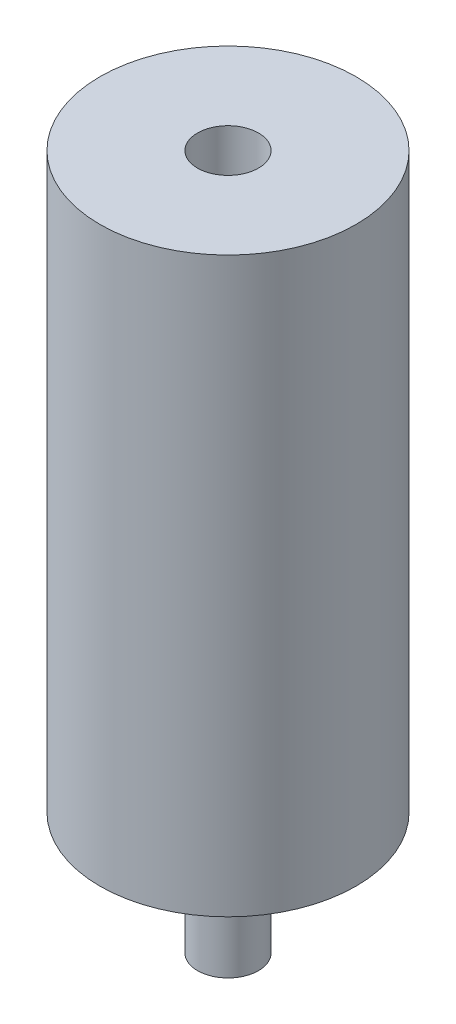
ISO-10303-21;
HEADER;
FILE_DESCRIPTION(('STEP AP214'),'2;1');
FILE_NAME('part.step','',(''),(''),'','','');
FILE_SCHEMA(('AUTOMOTIVE_DESIGN { 1 0 10303 214 1 1 1 1 }'));
ENDSEC;
DATA;
#1=APPLICATION_CONTEXT('core data for automotive mechanical design processes');
#2=APPLICATION_PROTOCOL_DEFINITION('international standard','automotive_design',2000,#1);
#3=PRODUCT_CONTEXT('',#1,'mechanical');
#4=PRODUCT('Part','Part','',(#3));
#5=PRODUCT_RELATED_PRODUCT_CATEGORY('part','',(#4));
#6=PRODUCT_DEFINITION_FORMATION('','',#4);
#7=PRODUCT_DEFINITION_CONTEXT('part definition',#1,'design');
#8=PRODUCT_DEFINITION('design','',#6,#7);
#9=PRODUCT_DEFINITION_SHAPE('','',#8);
#10=(LENGTH_UNIT() NAMED_UNIT(*) SI_UNIT(.MILLI.,.METRE.));
#11=(NAMED_UNIT(*) PLANE_ANGLE_UNIT() SI_UNIT($,.RADIAN.));
#12=(NAMED_UNIT(*) SI_UNIT($,.STERADIAN.) SOLID_ANGLE_UNIT());
#13=UNCERTAINTY_MEASURE_WITH_UNIT(LENGTH_MEASURE(1.E-05),#10,'distance_accuracy_value','');
#14=(GEOMETRIC_REPRESENTATION_CONTEXT(3) GLOBAL_UNCERTAINTY_ASSIGNED_CONTEXT((#13)) GLOBAL_UNIT_ASSIGNED_CONTEXT((#10,
#11,#12)) REPRESENTATION_CONTEXT('',''));
#15=CARTESIAN_POINT('',(0.,0.,0.));
#16=DIRECTION('',(0.,0.,1.));
#17=DIRECTION('',(1.,0.,0.));
#18=AXIS2_PLACEMENT_3D('',#15,#16,#17);
#19=CARTESIAN_POINT('',(0.,47.,0.));
#20=DIRECTION('',(0.,-1.,0.));
#21=DIRECTION('',(0.,0.,-1.));
#22=AXIS2_PLACEMENT_3D('',#19,#20,#21);
#23=CYLINDRICAL_SURFACE('',#22,10.5);
#24=CARTESIAN_POINT('',(0.,47.,0.));
#25=DIRECTION('',(0.,1.,0.));
#26=DIRECTION('',(0.,0.,1.));
#27=AXIS2_PLACEMENT_3D('',#24,#25,#26);
#28=CIRCLE('',#27,10.5);
#29=CARTESIAN_POINT('',(0.,47.,10.5));
#30=VERTEX_POINT('',#29);
#31=EDGE_CURVE('E45',#30,#30,#28,.T.);
#32=ORIENTED_EDGE('',*,*,#31,.F.);
#33=EDGE_LOOP('',(#32));
#34=FACE_BOUND('',#33,.T.);
#35=CARTESIAN_POINT('',(0.,0.,0.));
#36=DIRECTION('',(0.,1.,0.));
#37=DIRECTION('',(0.,0.,1.));
#38=AXIS2_PLACEMENT_3D('',#35,#36,#37);
#39=CIRCLE('',#38,10.5);
#40=CARTESIAN_POINT('',(0.,0.,10.5));
#41=VERTEX_POINT('',#40);
#42=EDGE_CURVE('E40',#41,#41,#39,.T.);
#43=ORIENTED_EDGE('',*,*,#42,.T.);
#44=EDGE_LOOP('',(#43));
#45=FACE_BOUND('',#44,.T.);
#46=ADVANCED_FACE('F37',(#34,#45),#23,.T.);
#47=CARTESIAN_POINT('',(0.,47.,0.));
#48=DIRECTION('',(0.,1.,0.));
#49=DIRECTION('',(0.,0.,1.));
#50=AXIS2_PLACEMENT_3D('',#47,#48,#49);
#51=PLANE('',#50);
#52=CARTESIAN_POINT('',(0.,47.,0.));
#53=DIRECTION('',(0.,1.,0.));
#54=DIRECTION('',(0.,0.,1.));
#55=AXIS2_PLACEMENT_3D('',#52,#53,#54);
#56=CIRCLE('',#55,2.5);
#57=CARTESIAN_POINT('',(0.,47.,2.5));
#58=VERTEX_POINT('',#57);
#59=EDGE_CURVE('E58',#58,#58,#56,.T.);
#60=ORIENTED_EDGE('',*,*,#59,.F.);
#61=EDGE_LOOP('',(#60));
#62=FACE_BOUND('',#61,.T.);
#63=ORIENTED_EDGE('',*,*,#31,.T.);
#64=EDGE_LOOP('',(#63));
#65=FACE_BOUND('',#64,.T.);
#66=ADVANCED_FACE('F82',(#62,#65),#51,.T.);
#67=CARTESIAN_POINT('',(0.,0.,0.));
#68=DIRECTION('',(0.,1.,0.));
#69=DIRECTION('',(0.,0.,1.));
#70=AXIS2_PLACEMENT_3D('',#67,#68,#69);
#71=PLANE('',#70);
#72=CARTESIAN_POINT('',(0.,0.,0.));
#73=DIRECTION('',(0.,-1.,0.));
#74=DIRECTION('',(0.,0.,-1.));
#75=AXIS2_PLACEMENT_3D('',#72,#73,#74);
#76=CIRCLE('',#75,2.5);
#77=CARTESIAN_POINT('',(0.,0.,-2.5));
#78=VERTEX_POINT('',#77);
#79=EDGE_CURVE('E10',#78,#78,#76,.T.);
#80=ORIENTED_EDGE('',*,*,#79,.F.);
#81=EDGE_LOOP('',(#80));
#82=FACE_BOUND('',#81,.T.);
#83=ORIENTED_EDGE('',*,*,#42,.F.);
#84=EDGE_LOOP('',(#83));
#85=FACE_BOUND('',#84,.T.);
#86=ADVANCED_FACE('F87',(#82,#85),#71,.F.);
#87=CARTESIAN_POINT('',(0.,37.,0.));
#88=DIRECTION('',(0.,1.,0.));
#89=DIRECTION('',(0.,0.,1.));
#90=AXIS2_PLACEMENT_3D('',#87,#88,#89);
#91=CYLINDRICAL_SURFACE('',#90,2.5);
#92=CARTESIAN_POINT('',(0.,37.,0.));
#93=DIRECTION('',(0.,1.,0.));
#94=DIRECTION('',(0.,0.,1.));
#95=AXIS2_PLACEMENT_3D('',#92,#93,#94);
#96=CIRCLE('',#95,2.5);
#97=CARTESIAN_POINT('',(0.,37.,2.5));
#98=VERTEX_POINT('',#97);
#99=EDGE_CURVE('E54',#98,#98,#96,.T.);
#100=ORIENTED_EDGE('',*,*,#99,.F.);
#101=EDGE_LOOP('',(#100));
#102=FACE_BOUND('',#101,.T.);
#103=ORIENTED_EDGE('',*,*,#59,.T.);
#104=EDGE_LOOP('',(#103));
#105=FACE_BOUND('',#104,.T.);
#106=ADVANCED_FACE('F78',(#102,#105),#91,.F.);
#107=CARTESIAN_POINT('',(0.,37.,0.));
#108=DIRECTION('',(0.,1.,0.));
#109=DIRECTION('',(0.,0.,1.));
#110=AXIS2_PLACEMENT_3D('',#107,#108,#109);
#111=PLANE('',#110);
#112=ORIENTED_EDGE('',*,*,#99,.T.);
#113=EDGE_LOOP('',(#112));
#114=FACE_BOUND('',#113,.T.);
#115=ADVANCED_FACE('F71',(#114),#111,.T.);
#116=CARTESIAN_POINT('',(0.,-10.,0.));
#117=DIRECTION('',(0.,1.,0.));
#118=DIRECTION('',(0.,0.,1.));
#119=AXIS2_PLACEMENT_3D('',#116,#117,#118);
#120=CYLINDRICAL_SURFACE('',#119,2.5);
#121=CARTESIAN_POINT('',(0.,-10.,0.));
#122=DIRECTION('',(0.,-1.,0.));
#123=DIRECTION('',(0.,0.,-1.));
#124=AXIS2_PLACEMENT_3D('',#121,#122,#123);
#125=CIRCLE('',#124,2.5);
#126=CARTESIAN_POINT('',(0.,-10.,-2.5));
#127=VERTEX_POINT('',#126);
#128=EDGE_CURVE('E53',#127,#127,#125,.T.);
#129=ORIENTED_EDGE('',*,*,#128,.F.);
#130=EDGE_LOOP('',(#129));
#131=FACE_BOUND('',#130,.T.);
#132=ORIENTED_EDGE('',*,*,#79,.T.);
#133=EDGE_LOOP('',(#132));
#134=FACE_BOUND('',#133,.T.);
#135=ADVANCED_FACE('F69',(#131,#134),#120,.T.);
#136=CARTESIAN_POINT('',(0.,-10.,0.));
#137=DIRECTION('',(0.,-1.,0.));
#138=DIRECTION('',(0.,0.,-1.));
#139=AXIS2_PLACEMENT_3D('',#136,#137,#138);
#140=PLANE('',#139);
#141=ORIENTED_EDGE('',*,*,#128,.T.);
#142=EDGE_LOOP('',(#141));
#143=FACE_BOUND('',#142,.T.);
#144=ADVANCED_FACE('F67',(#143),#140,.T.);
#145=CLOSED_SHELL('',(#46,#66,#86,#106,#115,#135,#144));
#146=MANIFOLD_SOLID_BREP('B2',#145);
#147=ADVANCED_BREP_SHAPE_REPRESENTATION('',(#18,#146),#14);
#148=SHAPE_DEFINITION_REPRESENTATION(#9,#147);
ENDSEC;
END-ISO-10303-21;
